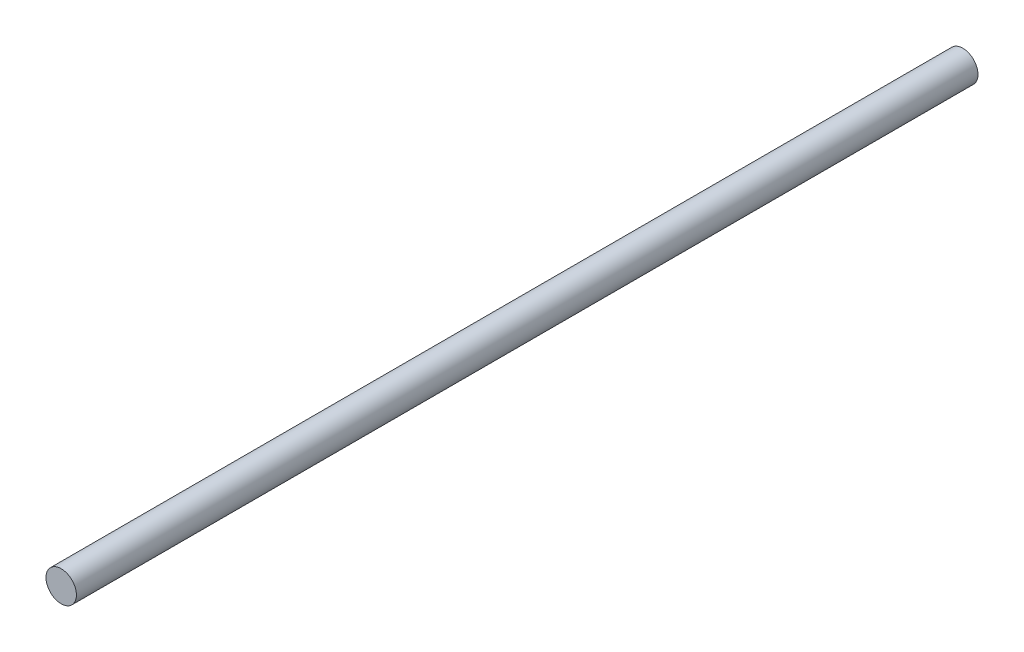
ISO-10303-21;
HEADER;
FILE_DESCRIPTION(('STEP AP214'),'2;1');
FILE_NAME('part.step','',(''),(''),'','','');
FILE_SCHEMA(('AUTOMOTIVE_DESIGN { 1 0 10303 214 1 1 1 1 }'));
ENDSEC;
DATA;
#1=APPLICATION_CONTEXT('core data for automotive mechanical design processes');
#2=APPLICATION_PROTOCOL_DEFINITION('international standard','automotive_design',2000,#1);
#3=PRODUCT_CONTEXT('',#1,'mechanical');
#4=PRODUCT('Part','Part','',(#3));
#5=PRODUCT_RELATED_PRODUCT_CATEGORY('part','',(#4));
#6=PRODUCT_DEFINITION_FORMATION('','',#4);
#7=PRODUCT_DEFINITION_CONTEXT('part definition',#1,'design');
#8=PRODUCT_DEFINITION('design','',#6,#7);
#9=PRODUCT_DEFINITION_SHAPE('','',#8);
#10=(LENGTH_UNIT() NAMED_UNIT(*) SI_UNIT(.MILLI.,.METRE.));
#11=(NAMED_UNIT(*) PLANE_ANGLE_UNIT() SI_UNIT($,.RADIAN.));
#12=(NAMED_UNIT(*) SI_UNIT($,.STERADIAN.) SOLID_ANGLE_UNIT());
#13=UNCERTAINTY_MEASURE_WITH_UNIT(LENGTH_MEASURE(1.E-05),#10,'distance_accuracy_value','');
#14=(GEOMETRIC_REPRESENTATION_CONTEXT(3) GLOBAL_UNCERTAINTY_ASSIGNED_CONTEXT((#13)) GLOBAL_UNIT_ASSIGNED_CONTEXT((#10,
#11,#12)) REPRESENTATION_CONTEXT('',''));
#15=CARTESIAN_POINT('',(0.,0.,0.));
#16=DIRECTION('',(0.,0.,1.));
#17=DIRECTION('',(1.,0.,0.));
#18=AXIS2_PLACEMENT_3D('',#15,#16,#17);
#19=CARTESIAN_POINT('',(0.,0.,355.6));
#20=DIRECTION('',(0.,0.,-1.));
#21=DIRECTION('',(-1.,0.,0.));
#22=AXIS2_PLACEMENT_3D('',#19,#20,#21);
#23=CYLINDRICAL_SURFACE('',#22,6.);
#24=CARTESIAN_POINT('',(0.,0.,355.6));
#25=DIRECTION('',(0.,0.,1.));
#26=DIRECTION('',(1.,0.,0.));
#27=AXIS2_PLACEMENT_3D('',#24,#25,#26);
#28=CIRCLE('',#27,6.);
#29=CARTESIAN_POINT('',(6.,0.,355.6));
#30=VERTEX_POINT('',#29);
#31=EDGE_CURVE('E10',#30,#30,#28,.T.);
#32=ORIENTED_EDGE('',*,*,#31,.F.);
#33=EDGE_LOOP('',(#32));
#34=FACE_BOUND('',#33,.T.);
#35=CARTESIAN_POINT('',(0.,0.,0.));
#36=DIRECTION('',(0.,0.,1.));
#37=DIRECTION('',(1.,0.,0.));
#38=AXIS2_PLACEMENT_3D('',#35,#36,#37);
#39=CIRCLE('',#38,6.);
#40=CARTESIAN_POINT('',(6.,0.,0.));
#41=VERTEX_POINT('',#40);
#42=EDGE_CURVE('E34',#41,#41,#39,.T.);
#43=ORIENTED_EDGE('',*,*,#42,.T.);
#44=EDGE_LOOP('',(#43));
#45=FACE_BOUND('',#44,.T.);
#46=ADVANCED_FACE('F31',(#34,#45),#23,.T.);
#47=CARTESIAN_POINT('',(0.,0.,355.6));
#48=DIRECTION('',(0.,0.,1.));
#49=DIRECTION('',(1.,0.,0.));
#50=AXIS2_PLACEMENT_3D('',#47,#48,#49);
#51=PLANE('',#50);
#52=ORIENTED_EDGE('',*,*,#31,.T.);
#53=EDGE_LOOP('',(#52));
#54=FACE_BOUND('',#53,.T.);
#55=ADVANCED_FACE('F46',(#54),#51,.T.);
#56=CARTESIAN_POINT('',(0.,0.,0.));
#57=DIRECTION('',(0.,0.,1.));
#58=DIRECTION('',(1.,0.,0.));
#59=AXIS2_PLACEMENT_3D('',#56,#57,#58);
#60=PLANE('',#59);
#61=ORIENTED_EDGE('',*,*,#42,.F.);
#62=EDGE_LOOP('',(#61));
#63=FACE_BOUND('',#62,.T.);
#64=ADVANCED_FACE('F44',(#63),#60,.F.);
#65=CLOSED_SHELL('',(#46,#55,#64));
#66=MANIFOLD_SOLID_BREP('B2',#65);
#67=ADVANCED_BREP_SHAPE_REPRESENTATION('',(#18,#66),#14);
#68=SHAPE_DEFINITION_REPRESENTATION(#9,#67);
ENDSEC;
END-ISO-10303-21;
